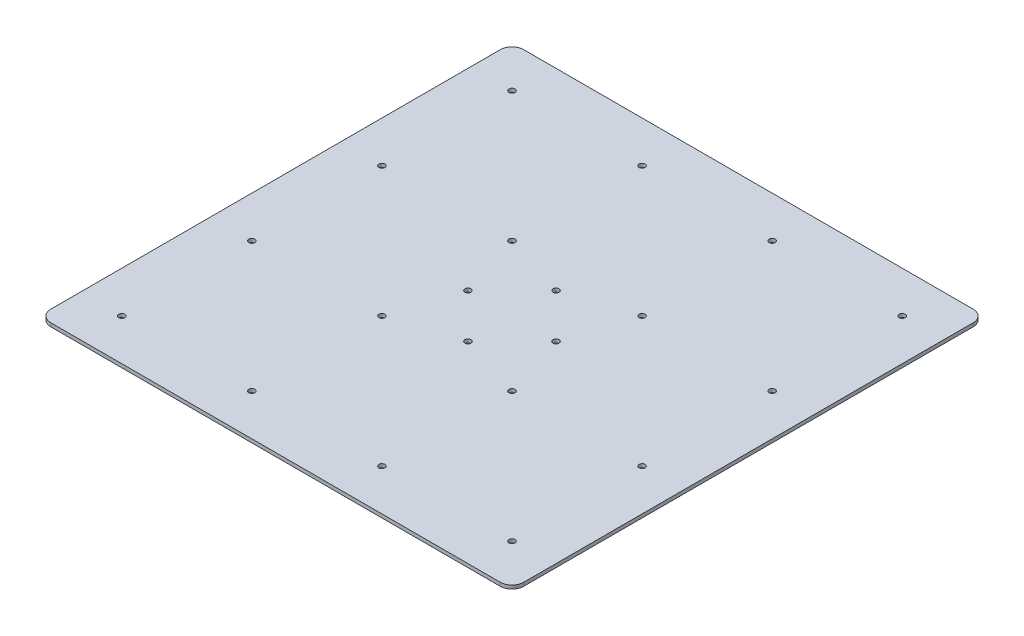
ISO-10303-21;
HEADER;
FILE_DESCRIPTION(('STEP AP214'),'2;1');
FILE_NAME('part.step','',(''),(''),'','','');
FILE_SCHEMA(('AUTOMOTIVE_DESIGN { 1 0 10303 214 1 1 1 1 }'));
ENDSEC;
DATA;
#1=APPLICATION_CONTEXT('core data for automotive mechanical design processes');
#2=APPLICATION_PROTOCOL_DEFINITION('international standard','automotive_design',2000,#1);
#3=PRODUCT_CONTEXT('',#1,'mechanical');
#4=PRODUCT('Part','Part','',(#3));
#5=PRODUCT_RELATED_PRODUCT_CATEGORY('part','',(#4));
#6=PRODUCT_DEFINITION_FORMATION('','',#4);
#7=PRODUCT_DEFINITION_CONTEXT('part definition',#1,'design');
#8=PRODUCT_DEFINITION('design','',#6,#7);
#9=PRODUCT_DEFINITION_SHAPE('','',#8);
#10=(LENGTH_UNIT() NAMED_UNIT(*) SI_UNIT(.MILLI.,.METRE.));
#11=(NAMED_UNIT(*) PLANE_ANGLE_UNIT() SI_UNIT($,.RADIAN.));
#12=(NAMED_UNIT(*) SI_UNIT($,.STERADIAN.) SOLID_ANGLE_UNIT());
#13=UNCERTAINTY_MEASURE_WITH_UNIT(LENGTH_MEASURE(1.E-05),#10,'distance_accuracy_value','');
#14=(GEOMETRIC_REPRESENTATION_CONTEXT(3) GLOBAL_UNCERTAINTY_ASSIGNED_CONTEXT((#13)) GLOBAL_UNIT_ASSIGNED_CONTEXT((#10,
#11,#12)) REPRESENTATION_CONTEXT('',''));
#15=CARTESIAN_POINT('',(0.,0.,0.));
#16=DIRECTION('',(0.,0.,1.));
#17=DIRECTION('',(1.,0.,0.));
#18=AXIS2_PLACEMENT_3D('',#15,#16,#17);
#19=CARTESIAN_POINT('',(200.,3.,-200.));
#20=DIRECTION('',(-1.,0.,0.));
#21=DIRECTION('',(0.,0.,1.));
#22=AXIS2_PLACEMENT_3D('',#19,#20,#21);
#23=PLANE('',#22);
#24=DIRECTION('',(0.,0.,-1.));
#25=VECTOR('',#24,1.);
#26=CARTESIAN_POINT('',(200.,3.,-200.));
#27=LINE('',#26,#25);
#28=CARTESIAN_POINT('',(200.,3.,190.));
#29=VERTEX_POINT('',#28);
#30=CARTESIAN_POINT('',(200.,3.,-190.));
#31=VERTEX_POINT('',#30);
#32=EDGE_CURVE('E135',#29,#31,#27,.T.);
#33=ORIENTED_EDGE('',*,*,#32,.F.);
#34=DIRECTION('',(0.,-1.,0.));
#35=VECTOR('',#34,1.);
#36=CARTESIAN_POINT('',(200.,3.,190.));
#37=LINE('',#36,#35);
#38=CARTESIAN_POINT('',(200.,0.,190.));
#39=VERTEX_POINT('',#38);
#40=EDGE_CURVE('E174',#29,#39,#37,.T.);
#41=ORIENTED_EDGE('',*,*,#40,.T.);
#42=DIRECTION('',(0.,0.,-1.));
#43=VECTOR('',#42,1.);
#44=CARTESIAN_POINT('',(200.,0.,-200.));
#45=LINE('',#44,#43);
#46=CARTESIAN_POINT('',(200.,0.,-190.));
#47=VERTEX_POINT('',#46);
#48=EDGE_CURVE('E189',#39,#47,#45,.T.);
#49=ORIENTED_EDGE('',*,*,#48,.T.);
#50=DIRECTION('',(0.,-1.,0.));
#51=VECTOR('',#50,1.);
#52=CARTESIAN_POINT('',(200.,3.,-190.));
#53=LINE('',#52,#51);
#54=EDGE_CURVE('E171',#47,#31,#53,.F.);
#55=ORIENTED_EDGE('',*,*,#54,.T.);
#56=EDGE_LOOP('',(#33,#41,#49,#55));
#57=FACE_BOUND('',#56,.T.);
#58=ADVANCED_FACE('F39',(#57),#23,.F.);
#59=CARTESIAN_POINT('',(-200.,3.,-200.));
#60=DIRECTION('',(0.,0.,1.));
#61=DIRECTION('',(1.,0.,0.));
#62=AXIS2_PLACEMENT_3D('',#59,#60,#61);
#63=PLANE('',#62);
#64=DIRECTION('',(-1.,0.,0.));
#65=VECTOR('',#64,1.);
#66=CARTESIAN_POINT('',(-200.,3.,-200.));
#67=LINE('',#66,#65);
#68=CARTESIAN_POINT('',(190.,3.,-200.));
#69=VERTEX_POINT('',#68);
#70=CARTESIAN_POINT('',(-190.,3.,-200.));
#71=VERTEX_POINT('',#70);
#72=EDGE_CURVE('E140',#69,#71,#67,.T.);
#73=ORIENTED_EDGE('',*,*,#72,.F.);
#74=DIRECTION('',(0.,-1.,0.));
#75=VECTOR('',#74,1.);
#76=CARTESIAN_POINT('',(190.,3.,-200.));
#77=LINE('',#76,#75);
#78=CARTESIAN_POINT('',(190.,0.,-200.));
#79=VERTEX_POINT('',#78);
#80=EDGE_CURVE('E11',#69,#79,#77,.T.);
#81=ORIENTED_EDGE('',*,*,#80,.T.);
#82=DIRECTION('',(-1.,0.,0.));
#83=VECTOR('',#82,1.);
#84=CARTESIAN_POINT('',(-200.,0.,-200.));
#85=LINE('',#84,#83);
#86=CARTESIAN_POINT('',(-190.,0.,-200.));
#87=VERTEX_POINT('',#86);
#88=EDGE_CURVE('E142',#79,#87,#85,.T.);
#89=ORIENTED_EDGE('',*,*,#88,.T.);
#90=DIRECTION('',(0.,-1.,0.));
#91=VECTOR('',#90,1.);
#92=CARTESIAN_POINT('',(-190.,3.,-200.));
#93=LINE('',#92,#91);
#94=EDGE_CURVE('E48',#87,#71,#93,.F.);
#95=ORIENTED_EDGE('',*,*,#94,.T.);
#96=EDGE_LOOP('',(#73,#81,#89,#95));
#97=FACE_BOUND('',#96,.T.);
#98=ADVANCED_FACE('F195',(#97),#63,.F.);
#99=CARTESIAN_POINT('',(-200.,3.,-200.));
#100=DIRECTION('',(1.,0.,0.));
#101=DIRECTION('',(0.,0.,-1.));
#102=AXIS2_PLACEMENT_3D('',#99,#100,#101);
#103=PLANE('',#102);
#104=DIRECTION('',(0.,0.,1.));
#105=VECTOR('',#104,1.);
#106=CARTESIAN_POINT('',(-200.,0.,-200.));
#107=LINE('',#106,#105);
#108=CARTESIAN_POINT('',(-200.,0.,-190.));
#109=VERTEX_POINT('',#108);
#110=CARTESIAN_POINT('',(-200.,0.,190.));
#111=VERTEX_POINT('',#110);
#112=EDGE_CURVE('E136',#109,#111,#107,.T.);
#113=ORIENTED_EDGE('',*,*,#112,.T.);
#114=DIRECTION('',(0.,-1.,0.));
#115=VECTOR('',#114,1.);
#116=CARTESIAN_POINT('',(-200.,3.,190.));
#117=LINE('',#116,#115);
#118=CARTESIAN_POINT('',(-200.,3.,190.));
#119=VERTEX_POINT('',#118);
#120=EDGE_CURVE('E111',#111,#119,#117,.F.);
#121=ORIENTED_EDGE('',*,*,#120,.T.);
#122=DIRECTION('',(0.,0.,1.));
#123=VECTOR('',#122,1.);
#124=CARTESIAN_POINT('',(-200.,3.,-200.));
#125=LINE('',#124,#123);
#126=CARTESIAN_POINT('',(-200.,3.,-190.));
#127=VERTEX_POINT('',#126);
#128=EDGE_CURVE('E180',#127,#119,#125,.T.);
#129=ORIENTED_EDGE('',*,*,#128,.F.);
#130=DIRECTION('',(0.,-1.,0.));
#131=VECTOR('',#130,1.);
#132=CARTESIAN_POINT('',(-200.,3.,-190.));
#133=LINE('',#132,#131);
#134=EDGE_CURVE('E117',#127,#109,#133,.T.);
#135=ORIENTED_EDGE('',*,*,#134,.T.);
#136=EDGE_LOOP('',(#113,#121,#129,#135));
#137=FACE_BOUND('',#136,.T.);
#138=ADVANCED_FACE('F202',(#137),#103,.F.);
#139=CARTESIAN_POINT('',(-200.,3.,200.));
#140=DIRECTION('',(0.,0.,-1.));
#141=DIRECTION('',(-1.,0.,0.));
#142=AXIS2_PLACEMENT_3D('',#139,#140,#141);
#143=PLANE('',#142);
#144=DIRECTION('',(1.,0.,0.));
#145=VECTOR('',#144,1.);
#146=CARTESIAN_POINT('',(-200.,3.,200.));
#147=LINE('',#146,#145);
#148=CARTESIAN_POINT('',(-190.,3.,200.));
#149=VERTEX_POINT('',#148);
#150=CARTESIAN_POINT('',(190.,3.,200.));
#151=VERTEX_POINT('',#150);
#152=EDGE_CURVE('E127',#149,#151,#147,.T.);
#153=ORIENTED_EDGE('',*,*,#152,.F.);
#154=DIRECTION('',(0.,-1.,0.));
#155=VECTOR('',#154,1.);
#156=CARTESIAN_POINT('',(-190.,3.,200.));
#157=LINE('',#156,#155);
#158=CARTESIAN_POINT('',(-190.,0.,200.));
#159=VERTEX_POINT('',#158);
#160=EDGE_CURVE('E110',#149,#159,#157,.T.);
#161=ORIENTED_EDGE('',*,*,#160,.T.);
#162=DIRECTION('',(1.,0.,0.));
#163=VECTOR('',#162,1.);
#164=CARTESIAN_POINT('',(-200.,0.,200.));
#165=LINE('',#164,#163);
#166=CARTESIAN_POINT('',(190.,0.,200.));
#167=VERTEX_POINT('',#166);
#168=EDGE_CURVE('E124',#159,#167,#165,.T.);
#169=ORIENTED_EDGE('',*,*,#168,.T.);
#170=DIRECTION('',(0.,-1.,0.));
#171=VECTOR('',#170,1.);
#172=CARTESIAN_POINT('',(190.,3.,200.));
#173=LINE('',#172,#171);
#174=EDGE_CURVE('E130',#167,#151,#173,.F.);
#175=ORIENTED_EDGE('',*,*,#174,.T.);
#176=EDGE_LOOP('',(#153,#161,#169,#175));
#177=FACE_BOUND('',#176,.T.);
#178=ADVANCED_FACE('F123',(#177),#143,.F.);
#179=CARTESIAN_POINT('',(0.,3.,0.));
#180=DIRECTION('',(0.,1.,0.));
#181=DIRECTION('',(0.,0.,1.));
#182=AXIS2_PLACEMENT_3D('',#179,#180,#181);
#183=PLANE('',#182);
#184=CARTESIAN_POINT('',(55.0000000000022,3.,55.));
#185=DIRECTION('',(0.,1.,0.));
#186=DIRECTION('',(0.,0.,1.));
#187=AXIS2_PLACEMENT_3D('',#184,#185,#186);
#188=CIRCLE('',#187,2.58);
#189=CARTESIAN_POINT('',(55.0000000000022,3.,57.58));
#190=VERTEX_POINT('',#189);
#191=EDGE_CURVE('E568',#190,#190,#188,.T.);
#192=ORIENTED_EDGE('',*,*,#191,.F.);
#193=EDGE_LOOP('',(#192));
#194=FACE_BOUND('',#193,.T.);
#195=CARTESIAN_POINT('',(-54.9999999999978,3.,55.));
#196=DIRECTION('',(0.,1.,0.));
#197=DIRECTION('',(0.,0.,1.));
#198=AXIS2_PLACEMENT_3D('',#195,#196,#197);
#199=CIRCLE('',#198,2.58);
#200=CARTESIAN_POINT('',(-54.9999999999978,3.,57.58));
#201=VERTEX_POINT('',#200);
#202=EDGE_CURVE('E577',#201,#201,#199,.T.);
#203=ORIENTED_EDGE('',*,*,#202,.F.);
#204=EDGE_LOOP('',(#203));
#205=FACE_BOUND('',#204,.T.);
#206=CARTESIAN_POINT('',(165.000000000001,3.,-55.));
#207=DIRECTION('',(0.,1.,0.));
#208=DIRECTION('',(0.,0.,1.));
#209=AXIS2_PLACEMENT_3D('',#206,#207,#208);
#210=CIRCLE('',#209,2.58);
#211=CARTESIAN_POINT('',(165.000000000001,3.,-52.42));
#212=VERTEX_POINT('',#211);
#213=EDGE_CURVE('E585',#212,#212,#210,.T.);
#214=ORIENTED_EDGE('',*,*,#213,.F.);
#215=EDGE_LOOP('',(#214));
#216=FACE_BOUND('',#215,.T.);
#217=CARTESIAN_POINT('',(55.0000000000011,3.,-55.));
#218=DIRECTION('',(0.,1.,0.));
#219=DIRECTION('',(0.,0.,1.));
#220=AXIS2_PLACEMENT_3D('',#217,#218,#219);
#221=CIRCLE('',#220,2.58);
#222=CARTESIAN_POINT('',(55.0000000000011,3.,-52.42));
#223=VERTEX_POINT('',#222);
#224=EDGE_CURVE('E593',#223,#223,#221,.T.);
#225=ORIENTED_EDGE('',*,*,#224,.F.);
#226=EDGE_LOOP('',(#225));
#227=FACE_BOUND('',#226,.T.);
#228=CARTESIAN_POINT('',(-55.0000000000001,3.,-165.));
#229=DIRECTION('',(0.,1.,0.));
#230=DIRECTION('',(0.,0.,1.));
#231=AXIS2_PLACEMENT_3D('',#228,#229,#230);
#232=CIRCLE('',#231,2.57999999999999);
#233=CARTESIAN_POINT('',(-55.0000000000001,3.,-162.42));
#234=VERTEX_POINT('',#233);
#235=EDGE_CURVE('E545',#234,#234,#232,.T.);
#236=ORIENTED_EDGE('',*,*,#235,.F.);
#237=EDGE_LOOP('',(#236));
#238=FACE_BOUND('',#237,.T.);
#239=CARTESIAN_POINT('',(54.9999999999999,3.,-165.));
#240=DIRECTION('',(0.,1.,0.));
#241=DIRECTION('',(0.,0.,1.));
#242=AXIS2_PLACEMENT_3D('',#239,#240,#241);
#243=CIRCLE('',#242,2.57999999999999);
#244=CARTESIAN_POINT('',(54.9999999999999,3.,-162.42));
#245=VERTEX_POINT('',#244);
#246=EDGE_CURVE('E536',#245,#245,#243,.T.);
#247=ORIENTED_EDGE('',*,*,#246,.F.);
#248=EDGE_LOOP('',(#247));
#249=FACE_BOUND('',#248,.T.);
#250=CARTESIAN_POINT('',(165.,3.,-165.));
#251=DIRECTION('',(0.,1.,0.));
#252=DIRECTION('',(0.,0.,1.));
#253=AXIS2_PLACEMENT_3D('',#250,#251,#252);
#254=CIRCLE('',#253,2.57999999999999);
#255=CARTESIAN_POINT('',(165.,3.,-162.42));
#256=VERTEX_POINT('',#255);
#257=EDGE_CURVE('E561',#256,#256,#254,.T.);
#258=ORIENTED_EDGE('',*,*,#257,.F.);
#259=EDGE_LOOP('',(#258));
#260=FACE_BOUND('',#259,.T.);
#261=CARTESIAN_POINT('',(-54.999999999999,3.,-55.));
#262=DIRECTION('',(0.,1.,0.));
#263=DIRECTION('',(0.,0.,1.));
#264=AXIS2_PLACEMENT_3D('',#261,#262,#263);
#265=CIRCLE('',#264,2.58);
#266=CARTESIAN_POINT('',(-54.999999999999,3.,-52.42));
#267=VERTEX_POINT('',#266);
#268=EDGE_CURVE('E552',#267,#267,#265,.T.);
#269=ORIENTED_EDGE('',*,*,#268,.F.);
#270=EDGE_LOOP('',(#269));
#271=FACE_BOUND('',#270,.T.);
#272=CARTESIAN_POINT('',(165.000000000003,3.,165.));
#273=DIRECTION('',(0.,1.,0.));
#274=DIRECTION('',(0.,0.,1.));
#275=AXIS2_PLACEMENT_3D('',#272,#273,#274);
#276=CIRCLE('',#275,2.57999999999999);
#277=CARTESIAN_POINT('',(165.000000000003,3.,167.58));
#278=VERTEX_POINT('',#277);
#279=EDGE_CURVE('E624',#278,#278,#276,.T.);
#280=ORIENTED_EDGE('',*,*,#279,.F.);
#281=EDGE_LOOP('',(#280));
#282=FACE_BOUND('',#281,.T.);
#283=CARTESIAN_POINT('',(55.0000000000034,3.,165.));
#284=DIRECTION('',(0.,1.,0.));
#285=DIRECTION('',(0.,0.,1.));
#286=AXIS2_PLACEMENT_3D('',#283,#284,#285);
#287=CIRCLE('',#286,2.57999999999999);
#288=CARTESIAN_POINT('',(55.0000000000034,3.,167.58));
#289=VERTEX_POINT('',#288);
#290=EDGE_CURVE('E648',#289,#289,#287,.T.);
#291=ORIENTED_EDGE('',*,*,#290,.F.);
#292=EDGE_LOOP('',(#291));
#293=FACE_BOUND('',#292,.T.);
#294=CARTESIAN_POINT('',(-54.9999999999967,3.,165.));
#295=DIRECTION('',(0.,1.,0.));
#296=DIRECTION('',(0.,0.,1.));
#297=AXIS2_PLACEMENT_3D('',#294,#295,#296);
#298=CIRCLE('',#297,2.57999999999999);
#299=CARTESIAN_POINT('',(-54.9999999999967,3.,167.58));
#300=VERTEX_POINT('',#299);
#301=EDGE_CURVE('E625',#300,#300,#298,.T.);
#302=ORIENTED_EDGE('',*,*,#301,.F.);
#303=EDGE_LOOP('',(#302));
#304=FACE_BOUND('',#303,.T.);
#305=CARTESIAN_POINT('',(165.000000000002,3.,55.));
#306=DIRECTION('',(0.,1.,0.));
#307=DIRECTION('',(0.,0.,1.));
#308=AXIS2_PLACEMENT_3D('',#305,#306,#307);
#309=CIRCLE('',#308,2.58);
#310=CARTESIAN_POINT('',(165.000000000002,3.,57.58));
#311=VERTEX_POINT('',#310);
#312=EDGE_CURVE('E634',#311,#311,#309,.T.);
#313=ORIENTED_EDGE('',*,*,#312,.F.);
#314=EDGE_LOOP('',(#313));
#315=FACE_BOUND('',#314,.T.);
#316=CARTESIAN_POINT('',(-164.999999999999,3.,-55.));
#317=DIRECTION('',(0.,1.,0.));
#318=DIRECTION('',(0.,0.,1.));
#319=AXIS2_PLACEMENT_3D('',#316,#317,#318);
#320=CIRCLE('',#319,2.58);
#321=CARTESIAN_POINT('',(-164.999999999999,3.,-52.42));
#322=VERTEX_POINT('',#321);
#323=EDGE_CURVE('E616',#322,#322,#320,.T.);
#324=ORIENTED_EDGE('',*,*,#323,.F.);
#325=EDGE_LOOP('',(#324));
#326=FACE_BOUND('',#325,.T.);
#327=CARTESIAN_POINT('',(-164.999999999998,3.,55.));
#328=DIRECTION('',(0.,1.,0.));
#329=DIRECTION('',(0.,0.,1.));
#330=AXIS2_PLACEMENT_3D('',#327,#328,#329);
#331=CIRCLE('',#330,2.58);
#332=CARTESIAN_POINT('',(-164.999999999998,3.,57.58));
#333=VERTEX_POINT('',#332);
#334=EDGE_CURVE('E608',#333,#333,#331,.T.);
#335=ORIENTED_EDGE('',*,*,#334,.F.);
#336=EDGE_LOOP('',(#335));
#337=FACE_BOUND('',#336,.T.);
#338=CARTESIAN_POINT('',(-164.999999999997,3.,165.));
#339=DIRECTION('',(0.,1.,0.));
#340=DIRECTION('',(0.,0.,1.));
#341=AXIS2_PLACEMENT_3D('',#338,#339,#340);
#342=CIRCLE('',#341,2.57999999999999);
#343=CARTESIAN_POINT('',(-164.999999999997,3.,167.58));
#344=VERTEX_POINT('',#343);
#345=EDGE_CURVE('E600',#344,#344,#342,.T.);
#346=ORIENTED_EDGE('',*,*,#345,.F.);
#347=EDGE_LOOP('',(#346));
#348=FACE_BOUND('',#347,.T.);
#349=CARTESIAN_POINT('',(-165.,3.,-165.));
#350=DIRECTION('',(0.,1.,0.));
#351=DIRECTION('',(0.,0.,1.));
#352=AXIS2_PLACEMENT_3D('',#349,#350,#351);
#353=CIRCLE('',#352,2.57999999999999);
#354=CARTESIAN_POINT('',(-165.,3.,-162.42));
#355=VERTEX_POINT('',#354);
#356=EDGE_CURVE('E528',#355,#355,#353,.T.);
#357=ORIENTED_EDGE('',*,*,#356,.F.);
#358=EDGE_LOOP('',(#357));
#359=FACE_BOUND('',#358,.T.);
#360=CARTESIAN_POINT('',(-3.87705226760231E-13,3.,37.25));
#361=DIRECTION('',(0.,1.,0.));
#362=DIRECTION('',(0.,0.,1.));
#363=AXIS2_PLACEMENT_3D('',#360,#361,#362);
#364=CIRCLE('',#363,2.58);
#365=CARTESIAN_POINT('',(-3.87705226760231E-13,3.,39.83));
#366=VERTEX_POINT('',#365);
#367=EDGE_CURVE('E521',#366,#366,#364,.T.);
#368=ORIENTED_EDGE('',*,*,#367,.F.);
#369=EDGE_LOOP('',(#368));
#370=FACE_BOUND('',#369,.T.);
#371=CARTESIAN_POINT('',(-37.25,3.,0.));
#372=DIRECTION('',(0.,1.,0.));
#373=DIRECTION('',(0.,0.,1.));
#374=AXIS2_PLACEMENT_3D('',#371,#372,#373);
#375=CIRCLE('',#374,2.58);
#376=CARTESIAN_POINT('',(-37.25,3.,2.58));
#377=VERTEX_POINT('',#376);
#378=EDGE_CURVE('E517',#377,#377,#375,.T.);
#379=ORIENTED_EDGE('',*,*,#378,.F.);
#380=EDGE_LOOP('',(#379));
#381=FACE_BOUND('',#380,.T.);
#382=CARTESIAN_POINT('',(1.20650973112511E-13,3.,-37.25));
#383=DIRECTION('',(0.,1.,0.));
#384=DIRECTION('',(0.,0.,1.));
#385=AXIS2_PLACEMENT_3D('',#382,#383,#384);
#386=CIRCLE('',#385,2.58);
#387=CARTESIAN_POINT('',(1.20650973112511E-13,3.,-34.67));
#388=VERTEX_POINT('',#387);
#389=EDGE_CURVE('E506',#388,#388,#386,.T.);
#390=ORIENTED_EDGE('',*,*,#389,.F.);
#391=EDGE_LOOP('',(#390));
#392=FACE_BOUND('',#391,.T.);
#393=CARTESIAN_POINT('',(37.25,3.,2.57647546888325E-13));
#394=DIRECTION('',(0.,1.,0.));
#395=DIRECTION('',(0.,0.,1.));
#396=AXIS2_PLACEMENT_3D('',#393,#394,#395);
#397=CIRCLE('',#396,2.58);
#398=CARTESIAN_POINT('',(37.25,3.,2.58000000000025));
#399=VERTEX_POINT('',#398);
#400=EDGE_CURVE('E498',#399,#399,#397,.T.);
#401=ORIENTED_EDGE('',*,*,#400,.F.);
#402=EDGE_LOOP('',(#401));
#403=FACE_BOUND('',#402,.T.);
#404=ORIENTED_EDGE('',*,*,#128,.T.);
#405=CARTESIAN_POINT('',(-190.,3.,190.));
#406=DIRECTION('',(0.,1.,0.));
#407=DIRECTION('',(0.,0.,1.));
#408=AXIS2_PLACEMENT_3D('',#405,#406,#407);
#409=CIRCLE('',#408,10.);
#410=EDGE_CURVE('E168',#119,#149,#409,.T.);
#411=ORIENTED_EDGE('',*,*,#410,.T.);
#412=ORIENTED_EDGE('',*,*,#152,.T.);
#413=CARTESIAN_POINT('',(190.,3.,190.));
#414=DIRECTION('',(0.,1.,0.));
#415=DIRECTION('',(0.,0.,1.));
#416=AXIS2_PLACEMENT_3D('',#413,#414,#415);
#417=CIRCLE('',#416,10.);
#418=EDGE_CURVE('E165',#151,#29,#417,.T.);
#419=ORIENTED_EDGE('',*,*,#418,.T.);
#420=ORIENTED_EDGE('',*,*,#32,.T.);
#421=CARTESIAN_POINT('',(190.,3.,-190.));
#422=DIRECTION('',(0.,1.,0.));
#423=DIRECTION('',(0.,0.,1.));
#424=AXIS2_PLACEMENT_3D('',#421,#422,#423);
#425=CIRCLE('',#424,10.);
#426=EDGE_CURVE('E61',#31,#69,#425,.T.);
#427=ORIENTED_EDGE('',*,*,#426,.T.);
#428=ORIENTED_EDGE('',*,*,#72,.T.);
#429=CARTESIAN_POINT('',(-190.,3.,-190.));
#430=DIRECTION('',(0.,1.,0.));
#431=DIRECTION('',(0.,0.,1.));
#432=AXIS2_PLACEMENT_3D('',#429,#430,#431);
#433=CIRCLE('',#432,10.);
#434=EDGE_CURVE('E160',#71,#127,#433,.T.);
#435=ORIENTED_EDGE('',*,*,#434,.T.);
#436=EDGE_LOOP('',(#404,#411,#412,#419,#420,#427,#428,#435));
#437=FACE_BOUND('',#436,.T.);
#438=ADVANCED_FACE('F200',(#194,#205,#216,#227,#238,#249,#260,#271,#282,#293,#304,#315,#326,
#337,#348,#359,#370,#381,#392,#403,#437),#183,.T.);
#439=CARTESIAN_POINT('',(0.,0.,0.));
#440=DIRECTION('',(0.,1.,0.));
#441=DIRECTION('',(0.,0.,1.));
#442=AXIS2_PLACEMENT_3D('',#439,#440,#441);
#443=PLANE('',#442);
#444=CARTESIAN_POINT('',(55.0000000000022,0.,55.));
#445=DIRECTION('',(0.,1.,0.));
#446=DIRECTION('',(0.,0.,1.));
#447=AXIS2_PLACEMENT_3D('',#444,#445,#446);
#448=CIRCLE('',#447,2.58);
#449=CARTESIAN_POINT('',(55.0000000000022,0.,57.58));
#450=VERTEX_POINT('',#449);
#451=EDGE_CURVE('E572',#450,#450,#448,.T.);
#452=ORIENTED_EDGE('',*,*,#451,.T.);
#453=EDGE_LOOP('',(#452));
#454=FACE_BOUND('',#453,.T.);
#455=CARTESIAN_POINT('',(-54.9999999999978,0.,55.));
#456=DIRECTION('',(0.,1.,0.));
#457=DIRECTION('',(0.,0.,1.));
#458=AXIS2_PLACEMENT_3D('',#455,#456,#457);
#459=CIRCLE('',#458,2.58);
#460=CARTESIAN_POINT('',(-54.9999999999978,0.,57.58));
#461=VERTEX_POINT('',#460);
#462=EDGE_CURVE('E581',#461,#461,#459,.T.);
#463=ORIENTED_EDGE('',*,*,#462,.T.);
#464=EDGE_LOOP('',(#463));
#465=FACE_BOUND('',#464,.T.);
#466=CARTESIAN_POINT('',(165.000000000001,0.,-55.));
#467=DIRECTION('',(0.,1.,0.));
#468=DIRECTION('',(0.,0.,1.));
#469=AXIS2_PLACEMENT_3D('',#466,#467,#468);
#470=CIRCLE('',#469,2.58);
#471=CARTESIAN_POINT('',(165.000000000001,0.,-52.42));
#472=VERTEX_POINT('',#471);
#473=EDGE_CURVE('E589',#472,#472,#470,.T.);
#474=ORIENTED_EDGE('',*,*,#473,.T.);
#475=EDGE_LOOP('',(#474));
#476=FACE_BOUND('',#475,.T.);
#477=CARTESIAN_POINT('',(55.0000000000011,0.,-55.));
#478=DIRECTION('',(0.,1.,0.));
#479=DIRECTION('',(0.,0.,1.));
#480=AXIS2_PLACEMENT_3D('',#477,#478,#479);
#481=CIRCLE('',#480,2.58);
#482=CARTESIAN_POINT('',(55.0000000000011,0.,-52.42));
#483=VERTEX_POINT('',#482);
#484=EDGE_CURVE('E557',#483,#483,#481,.T.);
#485=ORIENTED_EDGE('',*,*,#484,.T.);
#486=EDGE_LOOP('',(#485));
#487=FACE_BOUND('',#486,.T.);
#488=CARTESIAN_POINT('',(-55.0000000000001,0.,-165.));
#489=DIRECTION('',(0.,1.,0.));
#490=DIRECTION('',(0.,0.,1.));
#491=AXIS2_PLACEMENT_3D('',#488,#489,#490);
#492=CIRCLE('',#491,2.57999999999999);
#493=CARTESIAN_POINT('',(-55.0000000000001,0.,-162.42));
#494=VERTEX_POINT('',#493);
#495=EDGE_CURVE('E532',#494,#494,#492,.T.);
#496=ORIENTED_EDGE('',*,*,#495,.T.);
#497=EDGE_LOOP('',(#496));
#498=FACE_BOUND('',#497,.T.);
#499=CARTESIAN_POINT('',(54.9999999999999,0.,-165.));
#500=DIRECTION('',(0.,1.,0.));
#501=DIRECTION('',(0.,0.,1.));
#502=AXIS2_PLACEMENT_3D('',#499,#500,#501);
#503=CIRCLE('',#502,2.57999999999999);
#504=CARTESIAN_POINT('',(54.9999999999999,0.,-162.42));
#505=VERTEX_POINT('',#504);
#506=EDGE_CURVE('E540',#505,#505,#503,.T.);
#507=ORIENTED_EDGE('',*,*,#506,.T.);
#508=EDGE_LOOP('',(#507));
#509=FACE_BOUND('',#508,.T.);
#510=CARTESIAN_POINT('',(165.,0.,-165.));
#511=DIRECTION('',(0.,1.,0.));
#512=DIRECTION('',(0.,0.,1.));
#513=AXIS2_PLACEMENT_3D('',#510,#511,#512);
#514=CIRCLE('',#513,2.57999999999999);
#515=CARTESIAN_POINT('',(165.,0.,-162.42));
#516=VERTEX_POINT('',#515);
#517=EDGE_CURVE('E541',#516,#516,#514,.T.);
#518=ORIENTED_EDGE('',*,*,#517,.T.);
#519=EDGE_LOOP('',(#518));
#520=FACE_BOUND('',#519,.T.);
#521=CARTESIAN_POINT('',(-54.999999999999,0.,-55.));
#522=DIRECTION('',(0.,1.,0.));
#523=DIRECTION('',(0.,0.,1.));
#524=AXIS2_PLACEMENT_3D('',#521,#522,#523);
#525=CIRCLE('',#524,2.58);
#526=CARTESIAN_POINT('',(-54.999999999999,0.,-52.42));
#527=VERTEX_POINT('',#526);
#528=EDGE_CURVE('E556',#527,#527,#525,.T.);
#529=ORIENTED_EDGE('',*,*,#528,.T.);
#530=EDGE_LOOP('',(#529));
#531=FACE_BOUND('',#530,.T.);
#532=CARTESIAN_POINT('',(165.000000000003,0.,165.));
#533=DIRECTION('',(0.,1.,0.));
#534=DIRECTION('',(0.,0.,1.));
#535=AXIS2_PLACEMENT_3D('',#532,#533,#534);
#536=CIRCLE('',#535,2.57999999999999);
#537=CARTESIAN_POINT('',(165.000000000003,0.,167.58));
#538=VERTEX_POINT('',#537);
#539=EDGE_CURVE('E644',#538,#538,#536,.T.);
#540=ORIENTED_EDGE('',*,*,#539,.T.);
#541=EDGE_LOOP('',(#540));
#542=FACE_BOUND('',#541,.T.);
#543=CARTESIAN_POINT('',(55.0000000000034,0.,165.));
#544=DIRECTION('',(0.,1.,0.));
#545=DIRECTION('',(0.,0.,1.));
#546=AXIS2_PLACEMENT_3D('',#543,#544,#545);
#547=CIRCLE('',#546,2.57999999999999);
#548=CARTESIAN_POINT('',(55.0000000000034,0.,167.58));
#549=VERTEX_POINT('',#548);
#550=EDGE_CURVE('E630',#549,#549,#547,.T.);
#551=ORIENTED_EDGE('',*,*,#550,.T.);
#552=EDGE_LOOP('',(#551));
#553=FACE_BOUND('',#552,.T.);
#554=CARTESIAN_POINT('',(-54.9999999999967,0.,165.));
#555=DIRECTION('',(0.,1.,0.));
#556=DIRECTION('',(0.,0.,1.));
#557=AXIS2_PLACEMENT_3D('',#554,#555,#556);
#558=CIRCLE('',#557,2.57999999999999);
#559=CARTESIAN_POINT('',(-54.9999999999967,0.,167.58));
#560=VERTEX_POINT('',#559);
#561=EDGE_CURVE('E629',#560,#560,#558,.T.);
#562=ORIENTED_EDGE('',*,*,#561,.T.);
#563=EDGE_LOOP('',(#562));
#564=FACE_BOUND('',#563,.T.);
#565=CARTESIAN_POINT('',(165.000000000002,0.,55.));
#566=DIRECTION('',(0.,1.,0.));
#567=DIRECTION('',(0.,0.,1.));
#568=AXIS2_PLACEMENT_3D('',#565,#566,#567);
#569=CIRCLE('',#568,2.58);
#570=CARTESIAN_POINT('',(165.000000000002,0.,57.58));
#571=VERTEX_POINT('',#570);
#572=EDGE_CURVE('E573',#571,#571,#569,.T.);
#573=ORIENTED_EDGE('',*,*,#572,.T.);
#574=EDGE_LOOP('',(#573));
#575=FACE_BOUND('',#574,.T.);
#576=CARTESIAN_POINT('',(-164.999999999999,0.,-55.));
#577=DIRECTION('',(0.,1.,0.));
#578=DIRECTION('',(0.,0.,1.));
#579=AXIS2_PLACEMENT_3D('',#576,#577,#578);
#580=CIRCLE('',#579,2.58);
#581=CARTESIAN_POINT('',(-164.999999999999,0.,-52.42));
#582=VERTEX_POINT('',#581);
#583=EDGE_CURVE('E620',#582,#582,#580,.T.);
#584=ORIENTED_EDGE('',*,*,#583,.T.);
#585=EDGE_LOOP('',(#584));
#586=FACE_BOUND('',#585,.T.);
#587=CARTESIAN_POINT('',(-164.999999999998,0.,55.));
#588=DIRECTION('',(0.,1.,0.));
#589=DIRECTION('',(0.,0.,1.));
#590=AXIS2_PLACEMENT_3D('',#587,#588,#589);
#591=CIRCLE('',#590,2.58);
#592=CARTESIAN_POINT('',(-164.999999999998,0.,57.58));
#593=VERTEX_POINT('',#592);
#594=EDGE_CURVE('E612',#593,#593,#591,.T.);
#595=ORIENTED_EDGE('',*,*,#594,.T.);
#596=EDGE_LOOP('',(#595));
#597=FACE_BOUND('',#596,.T.);
#598=CARTESIAN_POINT('',(-164.999999999997,0.,165.));
#599=DIRECTION('',(0.,1.,0.));
#600=DIRECTION('',(0.,0.,1.));
#601=AXIS2_PLACEMENT_3D('',#598,#599,#600);
#602=CIRCLE('',#601,2.57999999999999);
#603=CARTESIAN_POINT('',(-164.999999999997,0.,167.58));
#604=VERTEX_POINT('',#603);
#605=EDGE_CURVE('E604',#604,#604,#602,.T.);
#606=ORIENTED_EDGE('',*,*,#605,.T.);
#607=EDGE_LOOP('',(#606));
#608=FACE_BOUND('',#607,.T.);
#609=CARTESIAN_POINT('',(-165.,0.,-165.));
#610=DIRECTION('',(0.,1.,0.));
#611=DIRECTION('',(0.,0.,1.));
#612=AXIS2_PLACEMENT_3D('',#609,#610,#611);
#613=CIRCLE('',#612,2.57999999999999);
#614=CARTESIAN_POINT('',(-165.,0.,-162.42));
#615=VERTEX_POINT('',#614);
#616=EDGE_CURVE('E508',#615,#615,#613,.T.);
#617=ORIENTED_EDGE('',*,*,#616,.T.);
#618=EDGE_LOOP('',(#617));
#619=FACE_BOUND('',#618,.T.);
#620=CARTESIAN_POINT('',(-3.87705226760231E-13,0.,37.25));
#621=DIRECTION('',(0.,1.,0.));
#622=DIRECTION('',(0.,0.,1.));
#623=AXIS2_PLACEMENT_3D('',#620,#621,#622);
#624=CIRCLE('',#623,2.58);
#625=CARTESIAN_POINT('',(-3.87705226760231E-13,0.,39.83));
#626=VERTEX_POINT('',#625);
#627=EDGE_CURVE('E192',#626,#626,#624,.T.);
#628=ORIENTED_EDGE('',*,*,#627,.T.);
#629=EDGE_LOOP('',(#628));
#630=FACE_BOUND('',#629,.T.);
#631=CARTESIAN_POINT('',(-37.25,0.,0.));
#632=DIRECTION('',(0.,1.,0.));
#633=DIRECTION('',(0.,0.,1.));
#634=AXIS2_PLACEMENT_3D('',#631,#632,#633);
#635=CIRCLE('',#634,2.58);
#636=CARTESIAN_POINT('',(-37.25,0.,2.58));
#637=VERTEX_POINT('',#636);
#638=EDGE_CURVE('E513',#637,#637,#635,.T.);
#639=ORIENTED_EDGE('',*,*,#638,.T.);
#640=EDGE_LOOP('',(#639));
#641=FACE_BOUND('',#640,.T.);
#642=CARTESIAN_POINT('',(1.20650973112511E-13,0.,-37.25));
#643=DIRECTION('',(0.,1.,0.));
#644=DIRECTION('',(0.,0.,1.));
#645=AXIS2_PLACEMENT_3D('',#642,#643,#644);
#646=CIRCLE('',#645,2.58);
#647=CARTESIAN_POINT('',(1.20650973112511E-13,0.,-34.67));
#648=VERTEX_POINT('',#647);
#649=EDGE_CURVE('E501',#648,#648,#646,.T.);
#650=ORIENTED_EDGE('',*,*,#649,.T.);
#651=EDGE_LOOP('',(#650));
#652=FACE_BOUND('',#651,.T.);
#653=CARTESIAN_POINT('',(37.25,0.,2.57647546888325E-13));
#654=DIRECTION('',(0.,1.,0.));
#655=DIRECTION('',(0.,0.,1.));
#656=AXIS2_PLACEMENT_3D('',#653,#654,#655);
#657=CIRCLE('',#656,2.58);
#658=CARTESIAN_POINT('',(37.25,0.,2.58000000000025));
#659=VERTEX_POINT('',#658);
#660=EDGE_CURVE('E495',#659,#659,#657,.T.);
#661=ORIENTED_EDGE('',*,*,#660,.T.);
#662=EDGE_LOOP('',(#661));
#663=FACE_BOUND('',#662,.T.);
#664=ORIENTED_EDGE('',*,*,#168,.F.);
#665=CARTESIAN_POINT('',(-190.,0.,190.));
#666=DIRECTION('',(0.,1.,0.));
#667=DIRECTION('',(0.,0.,1.));
#668=AXIS2_PLACEMENT_3D('',#665,#666,#667);
#669=CIRCLE('',#668,10.);
#670=EDGE_CURVE('E106',#159,#111,#669,.F.);
#671=ORIENTED_EDGE('',*,*,#670,.T.);
#672=ORIENTED_EDGE('',*,*,#112,.F.);
#673=CARTESIAN_POINT('',(-190.,0.,-190.));
#674=DIRECTION('',(0.,1.,0.));
#675=DIRECTION('',(0.,0.,1.));
#676=AXIS2_PLACEMENT_3D('',#673,#674,#675);
#677=CIRCLE('',#676,10.);
#678=EDGE_CURVE('E129',#109,#87,#677,.F.);
#679=ORIENTED_EDGE('',*,*,#678,.T.);
#680=ORIENTED_EDGE('',*,*,#88,.F.);
#681=CARTESIAN_POINT('',(190.,0.,-190.));
#682=DIRECTION('',(0.,1.,0.));
#683=DIRECTION('',(0.,0.,1.));
#684=AXIS2_PLACEMENT_3D('',#681,#682,#683);
#685=CIRCLE('',#684,10.);
#686=EDGE_CURVE('E150',#79,#47,#685,.F.);
#687=ORIENTED_EDGE('',*,*,#686,.T.);
#688=ORIENTED_EDGE('',*,*,#48,.F.);
#689=CARTESIAN_POINT('',(190.,0.,190.));
#690=DIRECTION('',(0.,1.,0.));
#691=DIRECTION('',(0.,0.,1.));
#692=AXIS2_PLACEMENT_3D('',#689,#690,#691);
#693=CIRCLE('',#692,10.);
#694=EDGE_CURVE('E118',#39,#167,#693,.F.);
#695=ORIENTED_EDGE('',*,*,#694,.T.);
#696=EDGE_LOOP('',(#664,#671,#672,#679,#680,#687,#688,#695));
#697=FACE_BOUND('',#696,.T.);
#698=ADVANCED_FACE('F132',(#454,#465,#476,#487,#498,#509,#520,#531,#542,#553,#564,#575,#586,
#597,#608,#619,#630,#641,#652,#663,#697),#443,.F.);
#699=CARTESIAN_POINT('',(37.25,0.,2.57647546888325E-13));
#700=DIRECTION('',(0.,1.,0.));
#701=DIRECTION('',(0.,0.,1.));
#702=AXIS2_PLACEMENT_3D('',#699,#700,#701);
#703=CYLINDRICAL_SURFACE('',#702,2.58);
#704=ORIENTED_EDGE('',*,*,#660,.F.);
#705=EDGE_LOOP('',(#704));
#706=FACE_BOUND('',#705,.T.);
#707=ORIENTED_EDGE('',*,*,#400,.T.);
#708=EDGE_LOOP('',(#707));
#709=FACE_BOUND('',#708,.T.);
#710=ADVANCED_FACE('F262',(#706,#709),#703,.F.);
#711=CARTESIAN_POINT('',(1.20650973112511E-13,0.,-37.25));
#712=DIRECTION('',(0.,1.,0.));
#713=DIRECTION('',(0.,0.,1.));
#714=AXIS2_PLACEMENT_3D('',#711,#712,#713);
#715=CYLINDRICAL_SURFACE('',#714,2.58);
#716=ORIENTED_EDGE('',*,*,#649,.F.);
#717=EDGE_LOOP('',(#716));
#718=FACE_BOUND('',#717,.T.);
#719=ORIENTED_EDGE('',*,*,#389,.T.);
#720=EDGE_LOOP('',(#719));
#721=FACE_BOUND('',#720,.T.);
#722=ADVANCED_FACE('F471',(#718,#721),#715,.F.);
#723=CARTESIAN_POINT('',(-37.25,0.,0.));
#724=DIRECTION('',(0.,1.,0.));
#725=DIRECTION('',(0.,0.,1.));
#726=AXIS2_PLACEMENT_3D('',#723,#724,#725);
#727=CYLINDRICAL_SURFACE('',#726,2.58);
#728=ORIENTED_EDGE('',*,*,#638,.F.);
#729=EDGE_LOOP('',(#728));
#730=FACE_BOUND('',#729,.T.);
#731=ORIENTED_EDGE('',*,*,#378,.T.);
#732=EDGE_LOOP('',(#731));
#733=FACE_BOUND('',#732,.T.);
#734=ADVANCED_FACE('F461',(#730,#733),#727,.F.);
#735=CARTESIAN_POINT('',(-3.87705226760231E-13,0.,37.25));
#736=DIRECTION('',(0.,1.,0.));
#737=DIRECTION('',(0.,0.,1.));
#738=AXIS2_PLACEMENT_3D('',#735,#736,#737);
#739=CYLINDRICAL_SURFACE('',#738,2.58);
#740=ORIENTED_EDGE('',*,*,#627,.F.);
#741=EDGE_LOOP('',(#740));
#742=FACE_BOUND('',#741,.T.);
#743=ORIENTED_EDGE('',*,*,#367,.T.);
#744=EDGE_LOOP('',(#743));
#745=FACE_BOUND('',#744,.T.);
#746=ADVANCED_FACE('F451',(#742,#745),#739,.F.);
#747=CARTESIAN_POINT('',(-165.,0.,-165.));
#748=DIRECTION('',(0.,1.,0.));
#749=DIRECTION('',(0.,0.,1.));
#750=AXIS2_PLACEMENT_3D('',#747,#748,#749);
#751=CYLINDRICAL_SURFACE('',#750,2.57999999999999);
#752=ORIENTED_EDGE('',*,*,#616,.F.);
#753=EDGE_LOOP('',(#752));
#754=FACE_BOUND('',#753,.T.);
#755=ORIENTED_EDGE('',*,*,#356,.T.);
#756=EDGE_LOOP('',(#755));
#757=FACE_BOUND('',#756,.T.);
#758=ADVANCED_FACE('F441',(#754,#757),#751,.F.);
#759=CARTESIAN_POINT('',(-164.999999999997,0.,165.));
#760=DIRECTION('',(0.,1.,0.));
#761=DIRECTION('',(0.,0.,1.));
#762=AXIS2_PLACEMENT_3D('',#759,#760,#761);
#763=CYLINDRICAL_SURFACE('',#762,2.57999999999999);
#764=ORIENTED_EDGE('',*,*,#605,.F.);
#765=EDGE_LOOP('',(#764));
#766=FACE_BOUND('',#765,.T.);
#767=ORIENTED_EDGE('',*,*,#345,.T.);
#768=EDGE_LOOP('',(#767));
#769=FACE_BOUND('',#768,.T.);
#770=ADVANCED_FACE('F431',(#766,#769),#763,.F.);
#771=CARTESIAN_POINT('',(-164.999999999998,0.,55.));
#772=DIRECTION('',(0.,1.,0.));
#773=DIRECTION('',(0.,0.,1.));
#774=AXIS2_PLACEMENT_3D('',#771,#772,#773);
#775=CYLINDRICAL_SURFACE('',#774,2.58);
#776=ORIENTED_EDGE('',*,*,#594,.F.);
#777=EDGE_LOOP('',(#776));
#778=FACE_BOUND('',#777,.T.);
#779=ORIENTED_EDGE('',*,*,#334,.T.);
#780=EDGE_LOOP('',(#779));
#781=FACE_BOUND('',#780,.T.);
#782=ADVANCED_FACE('F421',(#778,#781),#775,.F.);
#783=CARTESIAN_POINT('',(-164.999999999999,0.,-55.));
#784=DIRECTION('',(0.,1.,0.));
#785=DIRECTION('',(0.,0.,1.));
#786=AXIS2_PLACEMENT_3D('',#783,#784,#785);
#787=CYLINDRICAL_SURFACE('',#786,2.58);
#788=ORIENTED_EDGE('',*,*,#583,.F.);
#789=EDGE_LOOP('',(#788));
#790=FACE_BOUND('',#789,.T.);
#791=ORIENTED_EDGE('',*,*,#323,.T.);
#792=EDGE_LOOP('',(#791));
#793=FACE_BOUND('',#792,.T.);
#794=ADVANCED_FACE('F411',(#790,#793),#787,.F.);
#795=CARTESIAN_POINT('',(165.000000000002,0.,55.));
#796=DIRECTION('',(0.,1.,0.));
#797=DIRECTION('',(0.,0.,1.));
#798=AXIS2_PLACEMENT_3D('',#795,#796,#797);
#799=CYLINDRICAL_SURFACE('',#798,2.58);
#800=ORIENTED_EDGE('',*,*,#572,.F.);
#801=EDGE_LOOP('',(#800));
#802=FACE_BOUND('',#801,.T.);
#803=ORIENTED_EDGE('',*,*,#312,.T.);
#804=EDGE_LOOP('',(#803));
#805=FACE_BOUND('',#804,.T.);
#806=ADVANCED_FACE('F401',(#802,#805),#799,.F.);
#807=CARTESIAN_POINT('',(-54.9999999999967,0.,165.));
#808=DIRECTION('',(0.,1.,0.));
#809=DIRECTION('',(0.,0.,1.));
#810=AXIS2_PLACEMENT_3D('',#807,#808,#809);
#811=CYLINDRICAL_SURFACE('',#810,2.57999999999999);
#812=ORIENTED_EDGE('',*,*,#561,.F.);
#813=EDGE_LOOP('',(#812));
#814=FACE_BOUND('',#813,.T.);
#815=ORIENTED_EDGE('',*,*,#301,.T.);
#816=EDGE_LOOP('',(#815));
#817=FACE_BOUND('',#816,.T.);
#818=ADVANCED_FACE('F391',(#814,#817),#811,.F.);
#819=CARTESIAN_POINT('',(55.0000000000034,0.,165.));
#820=DIRECTION('',(0.,1.,0.));
#821=DIRECTION('',(0.,0.,1.));
#822=AXIS2_PLACEMENT_3D('',#819,#820,#821);
#823=CYLINDRICAL_SURFACE('',#822,2.57999999999999);
#824=ORIENTED_EDGE('',*,*,#550,.F.);
#825=EDGE_LOOP('',(#824));
#826=FACE_BOUND('',#825,.T.);
#827=ORIENTED_EDGE('',*,*,#290,.T.);
#828=EDGE_LOOP('',(#827));
#829=FACE_BOUND('',#828,.T.);
#830=ADVANCED_FACE('F381',(#826,#829),#823,.F.);
#831=CARTESIAN_POINT('',(165.000000000003,0.,165.));
#832=DIRECTION('',(0.,1.,0.));
#833=DIRECTION('',(0.,0.,1.));
#834=AXIS2_PLACEMENT_3D('',#831,#832,#833);
#835=CYLINDRICAL_SURFACE('',#834,2.57999999999999);
#836=ORIENTED_EDGE('',*,*,#539,.F.);
#837=EDGE_LOOP('',(#836));
#838=FACE_BOUND('',#837,.T.);
#839=ORIENTED_EDGE('',*,*,#279,.T.);
#840=EDGE_LOOP('',(#839));
#841=FACE_BOUND('',#840,.T.);
#842=ADVANCED_FACE('F371',(#838,#841),#835,.F.);
#843=CARTESIAN_POINT('',(-54.999999999999,0.,-55.));
#844=DIRECTION('',(0.,1.,0.));
#845=DIRECTION('',(0.,0.,1.));
#846=AXIS2_PLACEMENT_3D('',#843,#844,#845);
#847=CYLINDRICAL_SURFACE('',#846,2.58);
#848=ORIENTED_EDGE('',*,*,#528,.F.);
#849=EDGE_LOOP('',(#848));
#850=FACE_BOUND('',#849,.T.);
#851=ORIENTED_EDGE('',*,*,#268,.T.);
#852=EDGE_LOOP('',(#851));
#853=FACE_BOUND('',#852,.T.);
#854=ADVANCED_FACE('F361',(#850,#853),#847,.F.);
#855=CARTESIAN_POINT('',(165.,0.,-165.));
#856=DIRECTION('',(0.,1.,0.));
#857=DIRECTION('',(0.,0.,1.));
#858=AXIS2_PLACEMENT_3D('',#855,#856,#857);
#859=CYLINDRICAL_SURFACE('',#858,2.57999999999999);
#860=ORIENTED_EDGE('',*,*,#517,.F.);
#861=EDGE_LOOP('',(#860));
#862=FACE_BOUND('',#861,.T.);
#863=ORIENTED_EDGE('',*,*,#257,.T.);
#864=EDGE_LOOP('',(#863));
#865=FACE_BOUND('',#864,.T.);
#866=ADVANCED_FACE('F351',(#862,#865),#859,.F.);
#867=CARTESIAN_POINT('',(54.9999999999999,0.,-165.));
#868=DIRECTION('',(0.,1.,0.));
#869=DIRECTION('',(0.,0.,1.));
#870=AXIS2_PLACEMENT_3D('',#867,#868,#869);
#871=CYLINDRICAL_SURFACE('',#870,2.57999999999999);
#872=ORIENTED_EDGE('',*,*,#506,.F.);
#873=EDGE_LOOP('',(#872));
#874=FACE_BOUND('',#873,.T.);
#875=ORIENTED_EDGE('',*,*,#246,.T.);
#876=EDGE_LOOP('',(#875));
#877=FACE_BOUND('',#876,.T.);
#878=ADVANCED_FACE('F341',(#874,#877),#871,.F.);
#879=CARTESIAN_POINT('',(-55.0000000000001,0.,-165.));
#880=DIRECTION('',(0.,1.,0.));
#881=DIRECTION('',(0.,0.,1.));
#882=AXIS2_PLACEMENT_3D('',#879,#880,#881);
#883=CYLINDRICAL_SURFACE('',#882,2.57999999999999);
#884=ORIENTED_EDGE('',*,*,#495,.F.);
#885=EDGE_LOOP('',(#884));
#886=FACE_BOUND('',#885,.T.);
#887=ORIENTED_EDGE('',*,*,#235,.T.);
#888=EDGE_LOOP('',(#887));
#889=FACE_BOUND('',#888,.T.);
#890=ADVANCED_FACE('F331',(#886,#889),#883,.F.);
#891=CARTESIAN_POINT('',(55.0000000000011,0.,-55.));
#892=DIRECTION('',(0.,1.,0.));
#893=DIRECTION('',(0.,0.,1.));
#894=AXIS2_PLACEMENT_3D('',#891,#892,#893);
#895=CYLINDRICAL_SURFACE('',#894,2.58);
#896=ORIENTED_EDGE('',*,*,#484,.F.);
#897=EDGE_LOOP('',(#896));
#898=FACE_BOUND('',#897,.T.);
#899=ORIENTED_EDGE('',*,*,#224,.T.);
#900=EDGE_LOOP('',(#899));
#901=FACE_BOUND('',#900,.T.);
#902=ADVANCED_FACE('F321',(#898,#901),#895,.F.);
#903=CARTESIAN_POINT('',(165.000000000001,0.,-55.));
#904=DIRECTION('',(0.,1.,0.));
#905=DIRECTION('',(0.,0.,1.));
#906=AXIS2_PLACEMENT_3D('',#903,#904,#905);
#907=CYLINDRICAL_SURFACE('',#906,2.58);
#908=ORIENTED_EDGE('',*,*,#473,.F.);
#909=EDGE_LOOP('',(#908));
#910=FACE_BOUND('',#909,.T.);
#911=ORIENTED_EDGE('',*,*,#213,.T.);
#912=EDGE_LOOP('',(#911));
#913=FACE_BOUND('',#912,.T.);
#914=ADVANCED_FACE('F311',(#910,#913),#907,.F.);
#915=CARTESIAN_POINT('',(-54.9999999999978,0.,55.));
#916=DIRECTION('',(0.,1.,0.));
#917=DIRECTION('',(0.,0.,1.));
#918=AXIS2_PLACEMENT_3D('',#915,#916,#917);
#919=CYLINDRICAL_SURFACE('',#918,2.58);
#920=ORIENTED_EDGE('',*,*,#462,.F.);
#921=EDGE_LOOP('',(#920));
#922=FACE_BOUND('',#921,.T.);
#923=ORIENTED_EDGE('',*,*,#202,.T.);
#924=EDGE_LOOP('',(#923));
#925=FACE_BOUND('',#924,.T.);
#926=ADVANCED_FACE('F301',(#922,#925),#919,.F.);
#927=CARTESIAN_POINT('',(55.0000000000022,0.,55.));
#928=DIRECTION('',(0.,1.,0.));
#929=DIRECTION('',(0.,0.,1.));
#930=AXIS2_PLACEMENT_3D('',#927,#928,#929);
#931=CYLINDRICAL_SURFACE('',#930,2.58);
#932=ORIENTED_EDGE('',*,*,#451,.F.);
#933=EDGE_LOOP('',(#932));
#934=FACE_BOUND('',#933,.T.);
#935=ORIENTED_EDGE('',*,*,#191,.T.);
#936=EDGE_LOOP('',(#935));
#937=FACE_BOUND('',#936,.T.);
#938=ADVANCED_FACE('F221',(#934,#937),#931,.F.);
#939=CARTESIAN_POINT('',(-190.,3.,190.));
#940=DIRECTION('',(0.,-1.,0.));
#941=DIRECTION('',(0.,0.,-1.));
#942=AXIS2_PLACEMENT_3D('',#939,#940,#941);
#943=CYLINDRICAL_SURFACE('',#942,10.);
#944=ORIENTED_EDGE('',*,*,#410,.F.);
#945=ORIENTED_EDGE('',*,*,#120,.F.);
#946=ORIENTED_EDGE('',*,*,#670,.F.);
#947=ORIENTED_EDGE('',*,*,#160,.F.);
#948=EDGE_LOOP('',(#944,#945,#946,#947));
#949=FACE_BOUND('',#948,.T.);
#950=ADVANCED_FACE('F109',(#949),#943,.T.);
#951=CARTESIAN_POINT('',(190.,3.,190.));
#952=DIRECTION('',(0.,-1.,0.));
#953=DIRECTION('',(0.,0.,-1.));
#954=AXIS2_PLACEMENT_3D('',#951,#952,#953);
#955=CYLINDRICAL_SURFACE('',#954,10.);
#956=ORIENTED_EDGE('',*,*,#418,.F.);
#957=ORIENTED_EDGE('',*,*,#174,.F.);
#958=ORIENTED_EDGE('',*,*,#694,.F.);
#959=ORIENTED_EDGE('',*,*,#40,.F.);
#960=EDGE_LOOP('',(#956,#957,#958,#959));
#961=FACE_BOUND('',#960,.T.);
#962=ADVANCED_FACE('F220',(#961),#955,.T.);
#963=CARTESIAN_POINT('',(190.,3.,-190.));
#964=DIRECTION('',(0.,-1.,0.));
#965=DIRECTION('',(0.,0.,-1.));
#966=AXIS2_PLACEMENT_3D('',#963,#964,#965);
#967=CYLINDRICAL_SURFACE('',#966,10.);
#968=ORIENTED_EDGE('',*,*,#426,.F.);
#969=ORIENTED_EDGE('',*,*,#54,.F.);
#970=ORIENTED_EDGE('',*,*,#686,.F.);
#971=ORIENTED_EDGE('',*,*,#80,.F.);
#972=EDGE_LOOP('',(#968,#969,#970,#971));
#973=FACE_BOUND('',#972,.T.);
#974=ADVANCED_FACE('F223',(#973),#967,.T.);
#975=CARTESIAN_POINT('',(-190.,3.,-190.));
#976=DIRECTION('',(0.,-1.,0.));
#977=DIRECTION('',(0.,0.,-1.));
#978=AXIS2_PLACEMENT_3D('',#975,#976,#977);
#979=CYLINDRICAL_SURFACE('',#978,10.);
#980=ORIENTED_EDGE('',*,*,#434,.F.);
#981=ORIENTED_EDGE('',*,*,#94,.F.);
#982=ORIENTED_EDGE('',*,*,#678,.F.);
#983=ORIENTED_EDGE('',*,*,#134,.F.);
#984=EDGE_LOOP('',(#980,#981,#982,#983));
#985=FACE_BOUND('',#984,.T.);
#986=ADVANCED_FACE('F41',(#985),#979,.T.);
#987=CLOSED_SHELL('',(#58,#98,#138,#178,#438,#698,#710,#722,#734,#746,#758,#770,#782,#794,#806,
#818,#830,#842,#854,#866,#878,#890,#902,#914,#926,#938,#950,#962,#974,#986));
#988=MANIFOLD_SOLID_BREP('B2',#987);
#989=ADVANCED_BREP_SHAPE_REPRESENTATION('',(#18,#988),#14);
#990=SHAPE_DEFINITION_REPRESENTATION(#9,#989);
ENDSEC;
END-ISO-10303-21;
